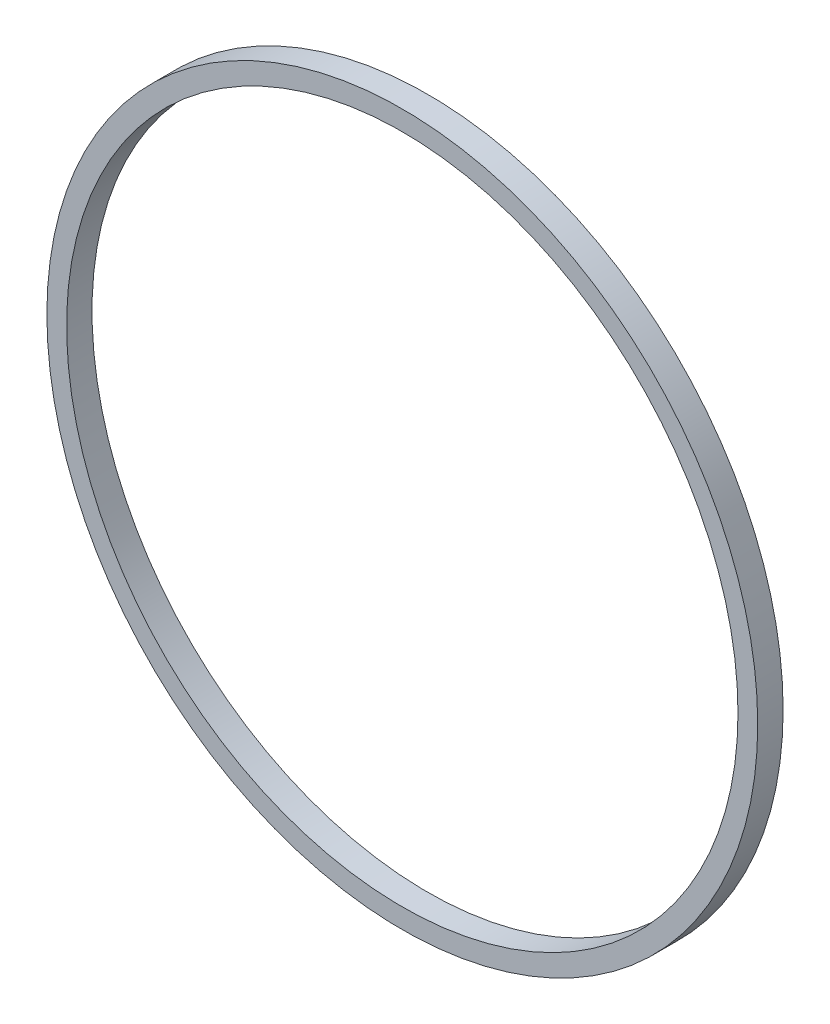
ISO-10303-21;
HEADER;
FILE_DESCRIPTION(('STEP AP214'),'2;1');
FILE_NAME('part.step','',(''),(''),'','','');
FILE_SCHEMA(('AUTOMOTIVE_DESIGN { 1 0 10303 214 1 1 1 1 }'));
ENDSEC;
DATA;
#1=APPLICATION_CONTEXT('core data for automotive mechanical design processes');
#2=APPLICATION_PROTOCOL_DEFINITION('international standard','automotive_design',2000,#1);
#3=PRODUCT_CONTEXT('',#1,'mechanical');
#4=PRODUCT('Part','Part','',(#3));
#5=PRODUCT_RELATED_PRODUCT_CATEGORY('part','',(#4));
#6=PRODUCT_DEFINITION_FORMATION('','',#4);
#7=PRODUCT_DEFINITION_CONTEXT('part definition',#1,'design');
#8=PRODUCT_DEFINITION('design','',#6,#7);
#9=PRODUCT_DEFINITION_SHAPE('','',#8);
#10=(LENGTH_UNIT() NAMED_UNIT(*) SI_UNIT(.MILLI.,.METRE.));
#11=(NAMED_UNIT(*) PLANE_ANGLE_UNIT() SI_UNIT($,.RADIAN.));
#12=(NAMED_UNIT(*) SI_UNIT($,.STERADIAN.) SOLID_ANGLE_UNIT());
#13=UNCERTAINTY_MEASURE_WITH_UNIT(LENGTH_MEASURE(1.E-05),#10,'distance_accuracy_value','');
#14=(GEOMETRIC_REPRESENTATION_CONTEXT(3) GLOBAL_UNCERTAINTY_ASSIGNED_CONTEXT((#13)) GLOBAL_UNIT_ASSIGNED_CONTEXT((#10,
#11,#12)) REPRESENTATION_CONTEXT('',''));
#15=CARTESIAN_POINT('',(0.,0.,0.));
#16=DIRECTION('',(0.,0.,1.));
#17=DIRECTION('',(1.,0.,0.));
#18=AXIS2_PLACEMENT_3D('',#15,#16,#17);
#19=CARTESIAN_POINT('',(70.1311792337728,84.2680326867233,4.5));
#20=DIRECTION('',(0.,0.,-1.));
#21=DIRECTION('',(-1.,0.,0.));
#22=AXIS2_PLACEMENT_3D('',#19,#20,#21);
#23=CYLINDRICAL_SURFACE('',#22,59.5);
#24=CARTESIAN_POINT('',(70.1311792337728,84.2680326867233,4.5));
#25=DIRECTION('',(0.,0.,1.));
#26=DIRECTION('',(1.,0.,0.));
#27=AXIS2_PLACEMENT_3D('',#24,#25,#26);
#28=CIRCLE('',#27,59.5);
#29=CARTESIAN_POINT('',(129.631179233773,84.2680326867233,4.5));
#30=VERTEX_POINT('',#29);
#31=EDGE_CURVE('E42',#30,#30,#28,.T.);
#32=ORIENTED_EDGE('',*,*,#31,.T.);
#33=EDGE_LOOP('',(#32));
#34=FACE_BOUND('',#33,.T.);
#35=CARTESIAN_POINT('',(70.1311792337728,84.2680326867233,0.));
#36=DIRECTION('',(0.,0.,1.));
#37=DIRECTION('',(1.,0.,0.));
#38=AXIS2_PLACEMENT_3D('',#35,#36,#37);
#39=CIRCLE('',#38,59.5);
#40=CARTESIAN_POINT('',(129.631179233773,84.2680326867233,0.));
#41=VERTEX_POINT('',#40);
#42=EDGE_CURVE('E48',#41,#41,#39,.T.);
#43=ORIENTED_EDGE('',*,*,#42,.F.);
#44=EDGE_LOOP('',(#43));
#45=FACE_BOUND('',#44,.T.);
#46=ADVANCED_FACE('F35',(#34,#45),#23,.F.);
#47=CARTESIAN_POINT('',(70.1311792337728,84.2680326867233,4.5));
#48=DIRECTION('',(0.,0.,-1.));
#49=DIRECTION('',(-1.,0.,0.));
#50=AXIS2_PLACEMENT_3D('',#47,#48,#49);
#51=CYLINDRICAL_SURFACE('',#50,63.);
#52=CARTESIAN_POINT('',(70.1311792337728,84.2680326867233,4.5));
#53=DIRECTION('',(0.,0.,1.));
#54=DIRECTION('',(1.,0.,0.));
#55=AXIS2_PLACEMENT_3D('',#52,#53,#54);
#56=CIRCLE('',#55,63.);
#57=CARTESIAN_POINT('',(133.131179233773,84.2680326867233,4.5));
#58=VERTEX_POINT('',#57);
#59=EDGE_CURVE('E10',#58,#58,#56,.T.);
#60=ORIENTED_EDGE('',*,*,#59,.F.);
#61=EDGE_LOOP('',(#60));
#62=FACE_BOUND('',#61,.T.);
#63=CARTESIAN_POINT('',(70.1311792337728,84.2680326867233,0.));
#64=DIRECTION('',(0.,0.,1.));
#65=DIRECTION('',(1.,0.,0.));
#66=AXIS2_PLACEMENT_3D('',#63,#64,#65);
#67=CIRCLE('',#66,63.);
#68=CARTESIAN_POINT('',(133.131179233773,84.2680326867233,0.));
#69=VERTEX_POINT('',#68);
#70=EDGE_CURVE('E38',#69,#69,#67,.T.);
#71=ORIENTED_EDGE('',*,*,#70,.T.);
#72=EDGE_LOOP('',(#71));
#73=FACE_BOUND('',#72,.T.);
#74=ADVANCED_FACE('F55',(#62,#73),#51,.T.);
#75=CARTESIAN_POINT('',(0.,0.,4.5));
#76=DIRECTION('',(0.,0.,1.));
#77=DIRECTION('',(1.,0.,0.));
#78=AXIS2_PLACEMENT_3D('',#75,#76,#77);
#79=PLANE('',#78);
#80=ORIENTED_EDGE('',*,*,#31,.F.);
#81=EDGE_LOOP('',(#80));
#82=FACE_BOUND('',#81,.T.);
#83=ORIENTED_EDGE('',*,*,#59,.T.);
#84=EDGE_LOOP('',(#83));
#85=FACE_BOUND('',#84,.T.);
#86=ADVANCED_FACE('F59',(#82,#85),#79,.T.);
#87=CARTESIAN_POINT('',(0.,0.,0.));
#88=DIRECTION('',(0.,0.,1.));
#89=DIRECTION('',(1.,0.,0.));
#90=AXIS2_PLACEMENT_3D('',#87,#88,#89);
#91=PLANE('',#90);
#92=ORIENTED_EDGE('',*,*,#42,.T.);
#93=EDGE_LOOP('',(#92));
#94=FACE_BOUND('',#93,.T.);
#95=ORIENTED_EDGE('',*,*,#70,.F.);
#96=EDGE_LOOP('',(#95));
#97=FACE_BOUND('',#96,.T.);
#98=ADVANCED_FACE('F57',(#94,#97),#91,.F.);
#99=CLOSED_SHELL('',(#46,#74,#86,#98));
#100=MANIFOLD_SOLID_BREP('B2',#99);
#101=ADVANCED_BREP_SHAPE_REPRESENTATION('',(#18,#100),#14);
#102=SHAPE_DEFINITION_REPRESENTATION(#9,#101);
ENDSEC;
END-ISO-10303-21;
